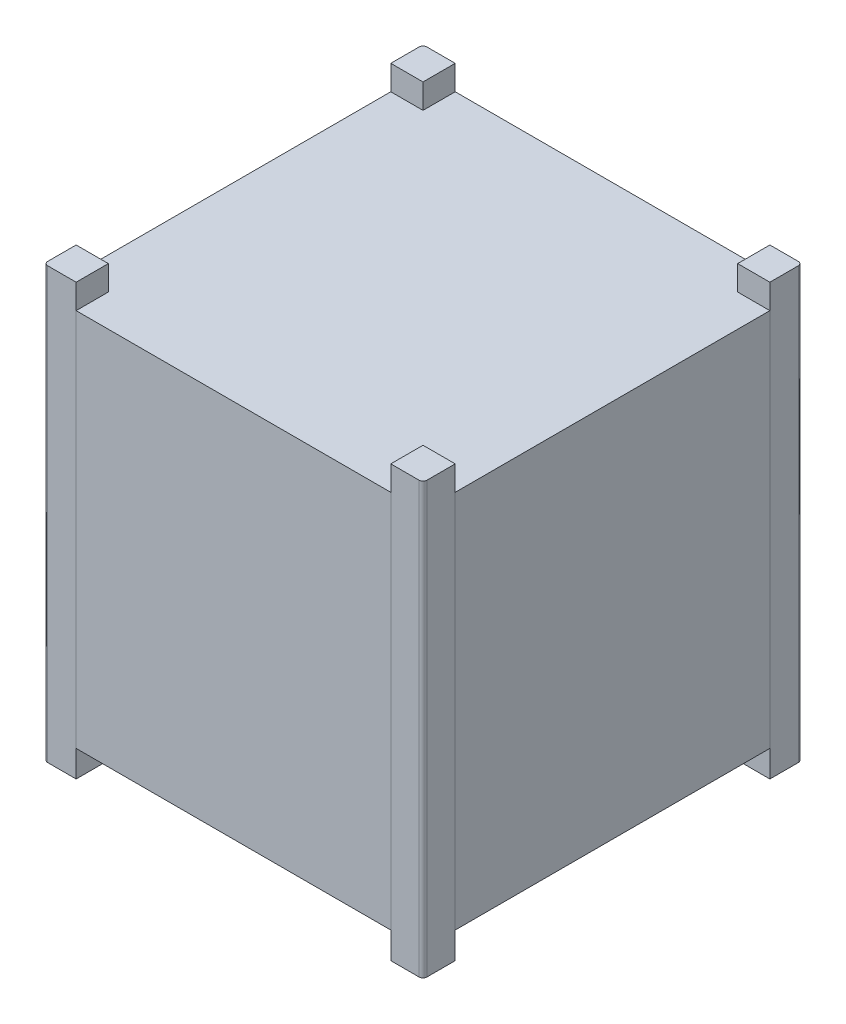
ISO-10303-21;
HEADER;
FILE_DESCRIPTION(('STEP AP214'),'2;1');
FILE_NAME('part.step','',(''),(''),'','','');
FILE_SCHEMA(('AUTOMOTIVE_DESIGN { 1 0 10303 214 1 1 1 1 }'));
ENDSEC;
DATA;
#1=APPLICATION_CONTEXT('core data for automotive mechanical design processes');
#2=APPLICATION_PROTOCOL_DEFINITION('international standard','automotive_design',2000,#1);
#3=PRODUCT_CONTEXT('',#1,'mechanical');
#4=PRODUCT('Part','Part','',(#3));
#5=PRODUCT_RELATED_PRODUCT_CATEGORY('part','',(#4));
#6=PRODUCT_DEFINITION_FORMATION('','',#4);
#7=PRODUCT_DEFINITION_CONTEXT('part definition',#1,'design');
#8=PRODUCT_DEFINITION('design','',#6,#7);
#9=PRODUCT_DEFINITION_SHAPE('','',#8);
#10=(LENGTH_UNIT() NAMED_UNIT(*) SI_UNIT(.MILLI.,.METRE.));
#11=(NAMED_UNIT(*) PLANE_ANGLE_UNIT() SI_UNIT($,.RADIAN.));
#12=(NAMED_UNIT(*) SI_UNIT($,.STERADIAN.) SOLID_ANGLE_UNIT());
#13=UNCERTAINTY_MEASURE_WITH_UNIT(LENGTH_MEASURE(1.E-05),#10,'distance_accuracy_value','');
#14=(GEOMETRIC_REPRESENTATION_CONTEXT(3) GLOBAL_UNCERTAINTY_ASSIGNED_CONTEXT((#13)) GLOBAL_UNIT_ASSIGNED_CONTEXT((#10,
#11,#12)) REPRESENTATION_CONTEXT('',''));
#15=CARTESIAN_POINT('',(0.,0.,0.));
#16=DIRECTION('',(0.,0.,1.));
#17=DIRECTION('',(1.,0.,0.));
#18=AXIS2_PLACEMENT_3D('',#15,#16,#17);
#19=CARTESIAN_POINT('',(50.,50.,50.));
#20=DIRECTION('',(-1.,0.,0.));
#21=DIRECTION('',(0.,0.,1.));
#22=AXIS2_PLACEMENT_3D('',#19,#20,#21);
#23=PLANE('',#22);
#24=DIRECTION('',(0.,1.,0.));
#25=VECTOR('',#24,1.);
#26=CARTESIAN_POINT('',(50.,50.,41.5));
#27=LINE('',#26,#25);
#28=CARTESIAN_POINT('',(50.,-50.,41.5));
#29=VERTEX_POINT('',#28);
#30=CARTESIAN_POINT('',(50.,50.,41.5));
#31=VERTEX_POINT('',#30);
#32=EDGE_CURVE('E582',#29,#31,#27,.T.);
#33=ORIENTED_EDGE('',*,*,#32,.F.);
#34=DIRECTION('',(0.,0.,-1.));
#35=VECTOR('',#34,1.);
#36=CARTESIAN_POINT('',(50.,-50.,50.));
#37=LINE('',#36,#35);
#38=CARTESIAN_POINT('',(50.,-50.,-41.5));
#39=VERTEX_POINT('',#38);
#40=EDGE_CURVE('E523',#29,#39,#37,.T.);
#41=ORIENTED_EDGE('',*,*,#40,.T.);
#42=DIRECTION('',(0.,-1.,0.));
#43=VECTOR('',#42,1.);
#44=CARTESIAN_POINT('',(50.,50.,-41.5));
#45=LINE('',#44,#43);
#46=CARTESIAN_POINT('',(50.,50.,-41.5));
#47=VERTEX_POINT('',#46);
#48=EDGE_CURVE('E576',#47,#39,#45,.T.);
#49=ORIENTED_EDGE('',*,*,#48,.F.);
#50=DIRECTION('',(0.,0.,-1.));
#51=VECTOR('',#50,1.);
#52=CARTESIAN_POINT('',(50.,50.,50.));
#53=LINE('',#52,#51);
#54=EDGE_CURVE('E524',#31,#47,#53,.T.);
#55=ORIENTED_EDGE('',*,*,#54,.F.);
#56=EDGE_LOOP('',(#33,#41,#49,#55));
#57=FACE_BOUND('',#56,.T.);
#58=ADVANCED_FACE('F45',(#57),#23,.F.);
#59=CARTESIAN_POINT('',(-50.,50.,50.));
#60=DIRECTION('',(1.,0.,0.));
#61=DIRECTION('',(0.,0.,-1.));
#62=AXIS2_PLACEMENT_3D('',#59,#60,#61);
#63=PLANE('',#62);
#64=DIRECTION('',(0.,-1.,0.));
#65=VECTOR('',#64,1.);
#66=CARTESIAN_POINT('',(-50.,50.,41.5));
#67=LINE('',#66,#65);
#68=CARTESIAN_POINT('',(-50.,50.,41.5));
#69=VERTEX_POINT('',#68);
#70=CARTESIAN_POINT('',(-50.,-50.,41.5));
#71=VERTEX_POINT('',#70);
#72=EDGE_CURVE('E579',#69,#71,#67,.T.);
#73=ORIENTED_EDGE('',*,*,#72,.F.);
#74=DIRECTION('',(0.,0.,1.));
#75=VECTOR('',#74,1.);
#76=CARTESIAN_POINT('',(-50.,50.,50.));
#77=LINE('',#76,#75);
#78=CARTESIAN_POINT('',(-50.,50.,-41.5));
#79=VERTEX_POINT('',#78);
#80=EDGE_CURVE('E533',#79,#69,#77,.T.);
#81=ORIENTED_EDGE('',*,*,#80,.F.);
#82=DIRECTION('',(0.,1.,0.));
#83=VECTOR('',#82,1.);
#84=CARTESIAN_POINT('',(-50.,50.,-41.5));
#85=LINE('',#84,#83);
#86=CARTESIAN_POINT('',(-50.,-50.,-41.5));
#87=VERTEX_POINT('',#86);
#88=EDGE_CURVE('E573',#87,#79,#85,.T.);
#89=ORIENTED_EDGE('',*,*,#88,.F.);
#90=DIRECTION('',(0.,0.,1.));
#91=VECTOR('',#90,1.);
#92=CARTESIAN_POINT('',(-50.,-50.,50.));
#93=LINE('',#92,#91);
#94=EDGE_CURVE('E548',#87,#71,#93,.T.);
#95=ORIENTED_EDGE('',*,*,#94,.T.);
#96=EDGE_LOOP('',(#73,#81,#89,#95));
#97=FACE_BOUND('',#96,.T.);
#98=ADVANCED_FACE('F693',(#97),#63,.F.);
#99=DIRECTION('',(0.,0.,1.));
#100=VECTOR('',#99,1.);
#101=CARTESIAN_POINT('',(50.,56.5,41.5));
#102=LINE('',#101,#100);
#103=CARTESIAN_POINT('',(50.,56.5,41.5));
#104=VERTEX_POINT('',#103);
#105=CARTESIAN_POINT('',(50.,56.5,49.));
#106=VERTEX_POINT('',#105);
#107=EDGE_CURVE('E451',#104,#106,#102,.T.);
#108=ORIENTED_EDGE('',*,*,#107,.T.);
#109=DIRECTION('',(0.,-1.,0.));
#110=VECTOR('',#109,1.);
#111=CARTESIAN_POINT('',(50.,50.,49.));
#112=LINE('',#111,#110);
#113=CARTESIAN_POINT('',(50.,-57.,49.));
#114=VERTEX_POINT('',#113);
#115=EDGE_CURVE('E621',#106,#114,#112,.T.);
#116=ORIENTED_EDGE('',*,*,#115,.T.);
#117=DIRECTION('',(0.,0.,1.));
#118=VECTOR('',#117,1.);
#119=CARTESIAN_POINT('',(50.,-57.,41.5));
#120=LINE('',#119,#118);
#121=CARTESIAN_POINT('',(50.,-57.,41.5));
#122=VERTEX_POINT('',#121);
#123=EDGE_CURVE('E448',#122,#114,#120,.T.);
#124=ORIENTED_EDGE('',*,*,#123,.F.);
#125=DIRECTION('',(0.,-1.,0.));
#126=VECTOR('',#125,1.);
#127=CARTESIAN_POINT('',(50.,56.5,41.5));
#128=LINE('',#127,#126);
#129=EDGE_CURVE('E426',#29,#122,#128,.T.);
#130=ORIENTED_EDGE('',*,*,#129,.F.);
#131=ORIENTED_EDGE('',*,*,#32,.T.);
#132=EDGE_CURVE('E427',#104,#31,#128,.T.);
#133=ORIENTED_EDGE('',*,*,#132,.F.);
#134=EDGE_LOOP('',(#108,#116,#124,#130,#131,#133));
#135=FACE_BOUND('',#134,.T.);
#136=ADVANCED_FACE('F755',(#135),#23,.F.);
#137=DIRECTION('',(0.,0.,1.));
#138=VECTOR('',#137,1.);
#139=CARTESIAN_POINT('',(-50.,-57.,41.5));
#140=LINE('',#139,#138);
#141=CARTESIAN_POINT('',(-50.,-57.,41.5));
#142=VERTEX_POINT('',#141);
#143=CARTESIAN_POINT('',(-50.,-57.,49.));
#144=VERTEX_POINT('',#143);
#145=EDGE_CURVE('E491',#142,#144,#140,.T.);
#146=ORIENTED_EDGE('',*,*,#145,.T.);
#147=DIRECTION('',(0.,-1.,0.));
#148=VECTOR('',#147,1.);
#149=CARTESIAN_POINT('',(-50.,50.,49.));
#150=LINE('',#149,#148);
#151=CARTESIAN_POINT('',(-50.,56.5,49.));
#152=VERTEX_POINT('',#151);
#153=EDGE_CURVE('E603',#144,#152,#150,.F.);
#154=ORIENTED_EDGE('',*,*,#153,.T.);
#155=DIRECTION('',(0.,0.,1.));
#156=VECTOR('',#155,1.);
#157=CARTESIAN_POINT('',(-50.,56.5,41.5));
#158=LINE('',#157,#156);
#159=CARTESIAN_POINT('',(-50.,56.5,41.5));
#160=VERTEX_POINT('',#159);
#161=EDGE_CURVE('E512',#160,#152,#158,.T.);
#162=ORIENTED_EDGE('',*,*,#161,.F.);
#163=DIRECTION('',(0.,1.,0.));
#164=VECTOR('',#163,1.);
#165=CARTESIAN_POINT('',(-50.,-57.,41.5));
#166=LINE('',#165,#164);
#167=EDGE_CURVE('E480',#69,#160,#166,.T.);
#168=ORIENTED_EDGE('',*,*,#167,.F.);
#169=ORIENTED_EDGE('',*,*,#72,.T.);
#170=EDGE_CURVE('E475',#142,#71,#166,.T.);
#171=ORIENTED_EDGE('',*,*,#170,.F.);
#172=EDGE_LOOP('',(#146,#154,#162,#168,#169,#171));
#173=FACE_BOUND('',#172,.T.);
#174=ADVANCED_FACE('F670',(#173),#63,.F.);
#175=CARTESIAN_POINT('',(-50.,50.,-50.));
#176=DIRECTION('',(0.,0.,1.));
#177=DIRECTION('',(1.,0.,0.));
#178=AXIS2_PLACEMENT_3D('',#175,#176,#177);
#179=PLANE('',#178);
#180=DIRECTION('',(0.,1.,0.));
#181=VECTOR('',#180,1.);
#182=CARTESIAN_POINT('',(41.5,50.,-50.));
#183=LINE('',#182,#181);
#184=CARTESIAN_POINT('',(41.5,-50.,-50.));
#185=VERTEX_POINT('',#184);
#186=CARTESIAN_POINT('',(41.5,50.,-50.));
#187=VERTEX_POINT('',#186);
#188=EDGE_CURVE('E570',#185,#187,#183,.T.);
#189=ORIENTED_EDGE('',*,*,#188,.F.);
#190=DIRECTION('',(-1.,0.,0.));
#191=VECTOR('',#190,1.);
#192=CARTESIAN_POINT('',(-50.,-50.,-50.));
#193=LINE('',#192,#191);
#194=CARTESIAN_POINT('',(-41.5,-50.,-50.));
#195=VERTEX_POINT('',#194);
#196=EDGE_CURVE('E545',#185,#195,#193,.T.);
#197=ORIENTED_EDGE('',*,*,#196,.T.);
#198=DIRECTION('',(0.,-1.,0.));
#199=VECTOR('',#198,1.);
#200=CARTESIAN_POINT('',(-41.5,50.,-50.));
#201=LINE('',#200,#199);
#202=CARTESIAN_POINT('',(-41.5,50.,-50.));
#203=VERTEX_POINT('',#202);
#204=EDGE_CURVE('E564',#203,#195,#201,.T.);
#205=ORIENTED_EDGE('',*,*,#204,.F.);
#206=DIRECTION('',(-1.,0.,0.));
#207=VECTOR('',#206,1.);
#208=CARTESIAN_POINT('',(-50.,50.,-50.));
#209=LINE('',#208,#207);
#210=EDGE_CURVE('E528',#187,#203,#209,.T.);
#211=ORIENTED_EDGE('',*,*,#210,.F.);
#212=EDGE_LOOP('',(#189,#197,#205,#211));
#213=FACE_BOUND('',#212,.T.);
#214=ADVANCED_FACE('F775',(#213),#179,.F.);
#215=CARTESIAN_POINT('',(-50.,50.,50.));
#216=DIRECTION('',(0.,0.,-1.));
#217=DIRECTION('',(-1.,0.,0.));
#218=AXIS2_PLACEMENT_3D('',#215,#216,#217);
#219=PLANE('',#218);
#220=DIRECTION('',(0.,-1.,0.));
#221=VECTOR('',#220,1.);
#222=CARTESIAN_POINT('',(41.5,50.,50.));
#223=LINE('',#222,#221);
#224=CARTESIAN_POINT('',(41.5,50.,50.));
#225=VERTEX_POINT('',#224);
#226=CARTESIAN_POINT('',(41.5,-50.,50.));
#227=VERTEX_POINT('',#226);
#228=EDGE_CURVE('E567',#225,#227,#223,.T.);
#229=ORIENTED_EDGE('',*,*,#228,.F.);
#230=DIRECTION('',(1.,0.,0.));
#231=VECTOR('',#230,1.);
#232=CARTESIAN_POINT('',(-50.,50.,50.));
#233=LINE('',#232,#231);
#234=CARTESIAN_POINT('',(-41.5,50.,50.));
#235=VERTEX_POINT('',#234);
#236=EDGE_CURVE('E537',#235,#225,#233,.T.);
#237=ORIENTED_EDGE('',*,*,#236,.F.);
#238=DIRECTION('',(0.,1.,0.));
#239=VECTOR('',#238,1.);
#240=CARTESIAN_POINT('',(-41.5,50.,50.));
#241=LINE('',#240,#239);
#242=CARTESIAN_POINT('',(-41.5,-50.,50.));
#243=VERTEX_POINT('',#242);
#244=EDGE_CURVE('E561',#243,#235,#241,.T.);
#245=ORIENTED_EDGE('',*,*,#244,.F.);
#246=DIRECTION('',(1.,0.,0.));
#247=VECTOR('',#246,1.);
#248=CARTESIAN_POINT('',(-50.,-50.,50.));
#249=LINE('',#248,#247);
#250=EDGE_CURVE('E529',#243,#227,#249,.T.);
#251=ORIENTED_EDGE('',*,*,#250,.T.);
#252=EDGE_LOOP('',(#229,#237,#245,#251));
#253=FACE_BOUND('',#252,.T.);
#254=ADVANCED_FACE('F736',(#253),#219,.F.);
#255=DIRECTION('',(1.,0.,0.));
#256=VECTOR('',#255,1.);
#257=CARTESIAN_POINT('',(41.5,56.5,-50.));
#258=LINE('',#257,#256);
#259=CARTESIAN_POINT('',(41.5,56.5,-50.));
#260=VERTEX_POINT('',#259);
#261=CARTESIAN_POINT('',(49.,56.5,-50.));
#262=VERTEX_POINT('',#261);
#263=EDGE_CURVE('E344',#260,#262,#258,.T.);
#264=ORIENTED_EDGE('',*,*,#263,.T.);
#265=DIRECTION('',(0.,-1.,0.));
#266=VECTOR('',#265,1.);
#267=CARTESIAN_POINT('',(49.,50.,-50.));
#268=LINE('',#267,#266);
#269=CARTESIAN_POINT('',(49.,-57.,-50.));
#270=VERTEX_POINT('',#269);
#271=EDGE_CURVE('E608',#262,#270,#268,.T.);
#272=ORIENTED_EDGE('',*,*,#271,.T.);
#273=DIRECTION('',(-1.,0.,0.));
#274=VECTOR('',#273,1.);
#275=CARTESIAN_POINT('',(41.5,-57.,-50.));
#276=LINE('',#275,#274);
#277=CARTESIAN_POINT('',(41.5,-57.,-50.));
#278=VERTEX_POINT('',#277);
#279=EDGE_CURVE('E340',#270,#278,#276,.T.);
#280=ORIENTED_EDGE('',*,*,#279,.T.);
#281=DIRECTION('',(0.,1.,0.));
#282=VECTOR('',#281,1.);
#283=CARTESIAN_POINT('',(41.5,56.5,-50.));
#284=LINE('',#283,#282);
#285=EDGE_CURVE('E302',#278,#185,#284,.T.);
#286=ORIENTED_EDGE('',*,*,#285,.T.);
#287=ORIENTED_EDGE('',*,*,#188,.T.);
#288=EDGE_CURVE('E341',#187,#260,#284,.T.);
#289=ORIENTED_EDGE('',*,*,#288,.T.);
#290=EDGE_LOOP('',(#264,#272,#280,#286,#287,#289));
#291=FACE_BOUND('',#290,.T.);
#292=ADVANCED_FACE('F821',(#291),#179,.F.);
#293=DIRECTION('',(-1.,0.,0.));
#294=VECTOR('',#293,1.);
#295=CARTESIAN_POINT('',(41.5,-57.,50.));
#296=LINE('',#295,#294);
#297=CARTESIAN_POINT('',(49.,-57.,50.));
#298=VERTEX_POINT('',#297);
#299=CARTESIAN_POINT('',(41.5,-57.,50.));
#300=VERTEX_POINT('',#299);
#301=EDGE_CURVE('E442',#298,#300,#296,.T.);
#302=ORIENTED_EDGE('',*,*,#301,.F.);
#303=DIRECTION('',(0.,-1.,0.));
#304=VECTOR('',#303,1.);
#305=CARTESIAN_POINT('',(49.,50.,50.));
#306=LINE('',#305,#304);
#307=CARTESIAN_POINT('',(49.,56.5,50.));
#308=VERTEX_POINT('',#307);
#309=EDGE_CURVE('E53',#298,#308,#306,.F.);
#310=ORIENTED_EDGE('',*,*,#309,.T.);
#311=DIRECTION('',(1.,0.,0.));
#312=VECTOR('',#311,1.);
#313=CARTESIAN_POINT('',(41.5,56.5,50.));
#314=LINE('',#313,#312);
#315=CARTESIAN_POINT('',(41.5,56.5,50.));
#316=VERTEX_POINT('',#315);
#317=EDGE_CURVE('E439',#316,#308,#314,.T.);
#318=ORIENTED_EDGE('',*,*,#317,.F.);
#319=DIRECTION('',(0.,1.,0.));
#320=VECTOR('',#319,1.);
#321=CARTESIAN_POINT('',(41.5,56.5,50.));
#322=LINE('',#321,#320);
#323=EDGE_CURVE('E417',#225,#316,#322,.T.);
#324=ORIENTED_EDGE('',*,*,#323,.F.);
#325=ORIENTED_EDGE('',*,*,#228,.T.);
#326=EDGE_CURVE('E435',#300,#227,#322,.T.);
#327=ORIENTED_EDGE('',*,*,#326,.F.);
#328=EDGE_LOOP('',(#302,#310,#318,#324,#325,#327));
#329=FACE_BOUND('',#328,.T.);
#330=ADVANCED_FACE('F739',(#329),#219,.F.);
#331=CARTESIAN_POINT('',(0.,50.,0.));
#332=DIRECTION('',(0.,-1.,0.));
#333=DIRECTION('',(0.,0.,-1.));
#334=AXIS2_PLACEMENT_3D('',#331,#332,#333);
#335=PLANE('',#334);
#336=DIRECTION('',(1.,0.,0.));
#337=VECTOR('',#336,1.);
#338=CARTESIAN_POINT('',(0.,50.,-41.5));
#339=LINE('',#338,#337);
#340=CARTESIAN_POINT('',(41.5,50.,-41.5));
#341=VERTEX_POINT('',#340);
#342=EDGE_CURVE('E365',#341,#47,#339,.T.);
#343=ORIENTED_EDGE('',*,*,#342,.F.);
#344=DIRECTION('',(0.,0.,-1.));
#345=VECTOR('',#344,1.);
#346=CARTESIAN_POINT('',(41.5,50.,0.));
#347=LINE('',#346,#345);
#348=EDGE_CURVE('E359',#341,#187,#347,.T.);
#349=ORIENTED_EDGE('',*,*,#348,.T.);
#350=ORIENTED_EDGE('',*,*,#210,.T.);
#351=DIRECTION('',(0.,0.,1.));
#352=VECTOR('',#351,1.);
#353=CARTESIAN_POINT('',(-41.5,50.,0.));
#354=LINE('',#353,#352);
#355=CARTESIAN_POINT('',(-41.5,50.,-41.5));
#356=VERTEX_POINT('',#355);
#357=EDGE_CURVE('E415',#203,#356,#354,.T.);
#358=ORIENTED_EDGE('',*,*,#357,.T.);
#359=DIRECTION('',(-1.,0.,0.));
#360=VECTOR('',#359,1.);
#361=CARTESIAN_POINT('',(0.,50.,-41.5));
#362=LINE('',#361,#360);
#363=EDGE_CURVE('E410',#356,#79,#362,.T.);
#364=ORIENTED_EDGE('',*,*,#363,.T.);
#365=ORIENTED_EDGE('',*,*,#80,.T.);
#366=DIRECTION('',(1.,0.,0.));
#367=VECTOR('',#366,1.);
#368=CARTESIAN_POINT('',(0.,50.,41.5));
#369=LINE('',#368,#367);
#370=CARTESIAN_POINT('',(-41.5,50.,41.5));
#371=VERTEX_POINT('',#370);
#372=EDGE_CURVE('E516',#69,#371,#369,.T.);
#373=ORIENTED_EDGE('',*,*,#372,.T.);
#374=DIRECTION('',(0.,0.,-1.));
#375=VECTOR('',#374,1.);
#376=CARTESIAN_POINT('',(-41.5,50.,0.));
#377=LINE('',#376,#375);
#378=EDGE_CURVE('E519',#235,#371,#377,.T.);
#379=ORIENTED_EDGE('',*,*,#378,.F.);
#380=ORIENTED_EDGE('',*,*,#236,.T.);
#381=DIRECTION('',(0.,0.,1.));
#382=VECTOR('',#381,1.);
#383=CARTESIAN_POINT('',(41.5,50.,0.));
#384=LINE('',#383,#382);
#385=CARTESIAN_POINT('',(41.5,50.,41.5));
#386=VERTEX_POINT('',#385);
#387=EDGE_CURVE('E463',#386,#225,#384,.T.);
#388=ORIENTED_EDGE('',*,*,#387,.F.);
#389=DIRECTION('',(-1.,0.,0.));
#390=VECTOR('',#389,1.);
#391=CARTESIAN_POINT('',(0.,50.,41.5));
#392=LINE('',#391,#390);
#393=EDGE_CURVE('E470',#31,#386,#392,.T.);
#394=ORIENTED_EDGE('',*,*,#393,.F.);
#395=ORIENTED_EDGE('',*,*,#54,.T.);
#396=EDGE_LOOP('',(#343,#349,#350,#358,#364,#365,#373,#379,#380,#388,#394,#395));
#397=FACE_BOUND('',#396,.T.);
#398=ADVANCED_FACE('F688',(#397),#335,.F.);
#399=CARTESIAN_POINT('',(0.,-50.,0.));
#400=DIRECTION('',(0.,-1.,0.));
#401=DIRECTION('',(0.,0.,-1.));
#402=AXIS2_PLACEMENT_3D('',#399,#400,#401);
#403=PLANE('',#402);
#404=DIRECTION('',(0.,0.,-1.));
#405=VECTOR('',#404,1.);
#406=CARTESIAN_POINT('',(41.5,-50.,0.));
#407=LINE('',#406,#405);
#408=CARTESIAN_POINT('',(41.5,-50.,-41.5));
#409=VERTEX_POINT('',#408);
#410=EDGE_CURVE('E307',#409,#185,#407,.T.);
#411=ORIENTED_EDGE('',*,*,#410,.F.);
#412=DIRECTION('',(1.,0.,0.));
#413=VECTOR('',#412,1.);
#414=CARTESIAN_POINT('',(0.,-50.,-41.5));
#415=LINE('',#414,#413);
#416=EDGE_CURVE('E316',#409,#39,#415,.T.);
#417=ORIENTED_EDGE('',*,*,#416,.T.);
#418=ORIENTED_EDGE('',*,*,#40,.F.);
#419=DIRECTION('',(-1.,0.,0.));
#420=VECTOR('',#419,1.);
#421=CARTESIAN_POINT('',(0.,-50.,41.5));
#422=LINE('',#421,#420);
#423=CARTESIAN_POINT('',(41.5,-50.,41.5));
#424=VERTEX_POINT('',#423);
#425=EDGE_CURVE('E466',#29,#424,#422,.T.);
#426=ORIENTED_EDGE('',*,*,#425,.T.);
#427=DIRECTION('',(0.,0.,1.));
#428=VECTOR('',#427,1.);
#429=CARTESIAN_POINT('',(41.5,-50.,0.));
#430=LINE('',#429,#428);
#431=EDGE_CURVE('E459',#424,#227,#430,.T.);
#432=ORIENTED_EDGE('',*,*,#431,.T.);
#433=ORIENTED_EDGE('',*,*,#250,.F.);
#434=DIRECTION('',(0.,0.,-1.));
#435=VECTOR('',#434,1.);
#436=CARTESIAN_POINT('',(-41.5,-50.,0.));
#437=LINE('',#436,#435);
#438=CARTESIAN_POINT('',(-41.5,-50.,41.5));
#439=VERTEX_POINT('',#438);
#440=EDGE_CURVE('E557',#243,#439,#437,.T.);
#441=ORIENTED_EDGE('',*,*,#440,.T.);
#442=DIRECTION('',(1.,0.,0.));
#443=VECTOR('',#442,1.);
#444=CARTESIAN_POINT('',(0.,-50.,41.5));
#445=LINE('',#444,#443);
#446=EDGE_CURVE('E541',#71,#439,#445,.T.);
#447=ORIENTED_EDGE('',*,*,#446,.F.);
#448=ORIENTED_EDGE('',*,*,#94,.F.);
#449=DIRECTION('',(-1.,0.,0.));
#450=VECTOR('',#449,1.);
#451=CARTESIAN_POINT('',(0.,-50.,-41.5));
#452=LINE('',#451,#450);
#453=CARTESIAN_POINT('',(-41.5,-50.,-41.5));
#454=VERTEX_POINT('',#453);
#455=EDGE_CURVE('E407',#454,#87,#452,.T.);
#456=ORIENTED_EDGE('',*,*,#455,.F.);
#457=DIRECTION('',(0.,0.,1.));
#458=VECTOR('',#457,1.);
#459=CARTESIAN_POINT('',(-41.5,-50.,0.));
#460=LINE('',#459,#458);
#461=EDGE_CURVE('E413',#195,#454,#460,.T.);
#462=ORIENTED_EDGE('',*,*,#461,.F.);
#463=ORIENTED_EDGE('',*,*,#196,.F.);
#464=EDGE_LOOP('',(#411,#417,#418,#426,#432,#433,#441,#447,#448,#456,#462,#463));
#465=FACE_BOUND('',#464,.T.);
#466=ADVANCED_FACE('F722',(#465),#403,.T.);
#467=DIRECTION('',(0.,0.,-1.));
#468=VECTOR('',#467,1.);
#469=CARTESIAN_POINT('',(50.,-57.,-41.5));
#470=LINE('',#469,#468);
#471=CARTESIAN_POINT('',(50.,-57.,-41.5));
#472=VERTEX_POINT('',#471);
#473=CARTESIAN_POINT('',(50.,-57.,-49.));
#474=VERTEX_POINT('',#473);
#475=EDGE_CURVE('E308',#472,#474,#470,.T.);
#476=ORIENTED_EDGE('',*,*,#475,.T.);
#477=DIRECTION('',(0.,-1.,0.));
#478=VECTOR('',#477,1.);
#479=CARTESIAN_POINT('',(50.,50.,-49.));
#480=LINE('',#479,#478);
#481=CARTESIAN_POINT('',(50.,56.5,-49.));
#482=VERTEX_POINT('',#481);
#483=EDGE_CURVE('E615',#474,#482,#480,.F.);
#484=ORIENTED_EDGE('',*,*,#483,.T.);
#485=DIRECTION('',(0.,0.,-1.));
#486=VECTOR('',#485,1.);
#487=CARTESIAN_POINT('',(50.,56.5,-41.5));
#488=LINE('',#487,#486);
#489=CARTESIAN_POINT('',(50.,56.5,-41.5));
#490=VERTEX_POINT('',#489);
#491=EDGE_CURVE('E351',#490,#482,#488,.T.);
#492=ORIENTED_EDGE('',*,*,#491,.F.);
#493=DIRECTION('',(0.,-1.,0.));
#494=VECTOR('',#493,1.);
#495=CARTESIAN_POINT('',(50.,56.5,-41.5));
#496=LINE('',#495,#494);
#497=EDGE_CURVE('E328',#490,#47,#496,.T.);
#498=ORIENTED_EDGE('',*,*,#497,.T.);
#499=ORIENTED_EDGE('',*,*,#48,.T.);
#500=EDGE_CURVE('E324',#39,#472,#496,.T.);
#501=ORIENTED_EDGE('',*,*,#500,.T.);
#502=EDGE_LOOP('',(#476,#484,#492,#498,#499,#501));
#503=FACE_BOUND('',#502,.T.);
#504=ADVANCED_FACE('F770',(#503),#23,.F.);
#505=DIRECTION('',(-1.,0.,0.));
#506=VECTOR('',#505,1.);
#507=CARTESIAN_POINT('',(-50.,-57.,-50.));
#508=LINE('',#507,#506);
#509=CARTESIAN_POINT('',(-41.5,-57.,-50.));
#510=VERTEX_POINT('',#509);
#511=CARTESIAN_POINT('',(-49.,-57.,-50.));
#512=VERTEX_POINT('',#511);
#513=EDGE_CURVE('E369',#510,#512,#508,.T.);
#514=ORIENTED_EDGE('',*,*,#513,.T.);
#515=DIRECTION('',(0.,-1.,0.));
#516=VECTOR('',#515,1.);
#517=CARTESIAN_POINT('',(-49.,50.,-50.));
#518=LINE('',#517,#516);
#519=CARTESIAN_POINT('',(-49.,56.5,-50.));
#520=VERTEX_POINT('',#519);
#521=EDGE_CURVE('E591',#512,#520,#518,.F.);
#522=ORIENTED_EDGE('',*,*,#521,.T.);
#523=DIRECTION('',(1.,0.,0.));
#524=VECTOR('',#523,1.);
#525=CARTESIAN_POINT('',(-50.,56.5,-50.));
#526=LINE('',#525,#524);
#527=CARTESIAN_POINT('',(-41.5,56.5,-50.));
#528=VERTEX_POINT('',#527);
#529=EDGE_CURVE('E393',#520,#528,#526,.T.);
#530=ORIENTED_EDGE('',*,*,#529,.T.);
#531=DIRECTION('',(0.,-1.,0.));
#532=VECTOR('',#531,1.);
#533=CARTESIAN_POINT('',(-41.5,-57.,-50.));
#534=LINE('',#533,#532);
#535=EDGE_CURVE('E390',#528,#203,#534,.T.);
#536=ORIENTED_EDGE('',*,*,#535,.T.);
#537=ORIENTED_EDGE('',*,*,#204,.T.);
#538=EDGE_CURVE('E389',#195,#510,#534,.T.);
#539=ORIENTED_EDGE('',*,*,#538,.T.);
#540=EDGE_LOOP('',(#514,#522,#530,#536,#537,#539));
#541=FACE_BOUND('',#540,.T.);
#542=ADVANCED_FACE('F780',(#541),#179,.F.);
#543=DIRECTION('',(0.,0.,-1.));
#544=VECTOR('',#543,1.);
#545=CARTESIAN_POINT('',(-50.,56.5,-41.5));
#546=LINE('',#545,#544);
#547=CARTESIAN_POINT('',(-50.,56.5,-41.5));
#548=VERTEX_POINT('',#547);
#549=CARTESIAN_POINT('',(-50.,56.5,-49.));
#550=VERTEX_POINT('',#549);
#551=EDGE_CURVE('E386',#548,#550,#546,.T.);
#552=ORIENTED_EDGE('',*,*,#551,.T.);
#553=DIRECTION('',(0.,-1.,0.));
#554=VECTOR('',#553,1.);
#555=CARTESIAN_POINT('',(-50.,50.,-49.));
#556=LINE('',#555,#554);
#557=CARTESIAN_POINT('',(-50.,-57.,-49.));
#558=VERTEX_POINT('',#557);
#559=EDGE_CURVE('E585',#550,#558,#556,.T.);
#560=ORIENTED_EDGE('',*,*,#559,.T.);
#561=DIRECTION('',(0.,0.,-1.));
#562=VECTOR('',#561,1.);
#563=CARTESIAN_POINT('',(-50.,-57.,-41.5));
#564=LINE('',#563,#562);
#565=CARTESIAN_POINT('',(-50.,-57.,-41.5));
#566=VERTEX_POINT('',#565);
#567=EDGE_CURVE('E403',#566,#558,#564,.T.);
#568=ORIENTED_EDGE('',*,*,#567,.F.);
#569=DIRECTION('',(0.,1.,0.));
#570=VECTOR('',#569,1.);
#571=CARTESIAN_POINT('',(-50.,-57.,-41.5));
#572=LINE('',#571,#570);
#573=EDGE_CURVE('E370',#566,#87,#572,.T.);
#574=ORIENTED_EDGE('',*,*,#573,.T.);
#575=ORIENTED_EDGE('',*,*,#88,.T.);
#576=EDGE_CURVE('E375',#79,#548,#572,.T.);
#577=ORIENTED_EDGE('',*,*,#576,.T.);
#578=EDGE_LOOP('',(#552,#560,#568,#574,#575,#577));
#579=FACE_BOUND('',#578,.T.);
#580=ADVANCED_FACE('F700',(#579),#63,.F.);
#581=DIRECTION('',(1.,0.,0.));
#582=VECTOR('',#581,1.);
#583=CARTESIAN_POINT('',(-50.,56.5,50.));
#584=LINE('',#583,#582);
#585=CARTESIAN_POINT('',(-49.,56.5,50.));
#586=VERTEX_POINT('',#585);
#587=CARTESIAN_POINT('',(-41.5,56.5,50.));
#588=VERTEX_POINT('',#587);
#589=EDGE_CURVE('E474',#586,#588,#584,.T.);
#590=ORIENTED_EDGE('',*,*,#589,.F.);
#591=DIRECTION('',(0.,-1.,0.));
#592=VECTOR('',#591,1.);
#593=CARTESIAN_POINT('',(-49.,50.,50.));
#594=LINE('',#593,#592);
#595=CARTESIAN_POINT('',(-49.,-57.,50.));
#596=VERTEX_POINT('',#595);
#597=EDGE_CURVE('E596',#586,#596,#594,.T.);
#598=ORIENTED_EDGE('',*,*,#597,.T.);
#599=DIRECTION('',(-1.,0.,0.));
#600=VECTOR('',#599,1.);
#601=CARTESIAN_POINT('',(-50.,-57.,50.));
#602=LINE('',#601,#600);
#603=CARTESIAN_POINT('',(-41.5,-57.,50.));
#604=VERTEX_POINT('',#603);
#605=EDGE_CURVE('E498',#604,#596,#602,.T.);
#606=ORIENTED_EDGE('',*,*,#605,.F.);
#607=DIRECTION('',(0.,-1.,0.));
#608=VECTOR('',#607,1.);
#609=CARTESIAN_POINT('',(-41.5,-57.,50.));
#610=LINE('',#609,#608);
#611=EDGE_CURVE('E493',#243,#604,#610,.T.);
#612=ORIENTED_EDGE('',*,*,#611,.F.);
#613=ORIENTED_EDGE('',*,*,#244,.T.);
#614=EDGE_CURVE('E494',#588,#235,#610,.T.);
#615=ORIENTED_EDGE('',*,*,#614,.F.);
#616=EDGE_LOOP('',(#590,#598,#606,#612,#613,#615));
#617=FACE_BOUND('',#616,.T.);
#618=ADVANCED_FACE('F680',(#617),#219,.F.);
#619=CARTESIAN_POINT('',(-50.,-57.,41.5));
#620=DIRECTION('',(0.,1.,0.));
#621=DIRECTION('',(0.,0.,1.));
#622=AXIS2_PLACEMENT_3D('',#619,#620,#621);
#623=PLANE('',#622);
#624=ORIENTED_EDGE('',*,*,#605,.T.);
#625=CARTESIAN_POINT('',(-49.,-57.,49.));
#626=DIRECTION('',(0.,1.,0.));
#627=DIRECTION('',(0.,0.,1.));
#628=AXIS2_PLACEMENT_3D('',#625,#626,#627);
#629=CIRCLE('',#628,1.);
#630=EDGE_CURVE('E600',#596,#144,#629,.F.);
#631=ORIENTED_EDGE('',*,*,#630,.T.);
#632=ORIENTED_EDGE('',*,*,#145,.F.);
#633=DIRECTION('',(-1.,0.,0.));
#634=VECTOR('',#633,1.);
#635=CARTESIAN_POINT('',(-50.,-57.,41.5));
#636=LINE('',#635,#634);
#637=CARTESIAN_POINT('',(-41.5,-57.,41.5));
#638=VERTEX_POINT('',#637);
#639=EDGE_CURVE('E488',#638,#142,#636,.T.);
#640=ORIENTED_EDGE('',*,*,#639,.F.);
#641=DIRECTION('',(0.,0.,1.));
#642=VECTOR('',#641,1.);
#643=CARTESIAN_POINT('',(-41.5,-57.,41.5));
#644=LINE('',#643,#642);
#645=EDGE_CURVE('E505',#638,#604,#644,.T.);
#646=ORIENTED_EDGE('',*,*,#645,.T.);
#647=EDGE_LOOP('',(#624,#631,#632,#640,#646));
#648=FACE_BOUND('',#647,.T.);
#649=ADVANCED_FACE('F730',(#648),#623,.F.);
#650=CARTESIAN_POINT('',(0.,0.,41.5));
#651=DIRECTION('',(0.,0.,-1.));
#652=DIRECTION('',(-1.,0.,0.));
#653=AXIS2_PLACEMENT_3D('',#650,#651,#652);
#654=PLANE('',#653);
#655=ORIENTED_EDGE('',*,*,#170,.T.);
#656=ORIENTED_EDGE('',*,*,#446,.T.);
#657=DIRECTION('',(0.,-1.,0.));
#658=VECTOR('',#657,1.);
#659=CARTESIAN_POINT('',(-41.5,-57.,41.5));
#660=LINE('',#659,#658);
#661=EDGE_CURVE('E483',#439,#638,#660,.T.);
#662=ORIENTED_EDGE('',*,*,#661,.T.);
#663=ORIENTED_EDGE('',*,*,#639,.T.);
#664=EDGE_LOOP('',(#655,#656,#662,#663));
#665=FACE_BOUND('',#664,.T.);
#666=ADVANCED_FACE('F725',(#665),#654,.T.);
#667=CARTESIAN_POINT('',(-41.5,-57.,41.5));
#668=DIRECTION('',(-1.,0.,0.));
#669=DIRECTION('',(0.,-1.,0.));
#670=AXIS2_PLACEMENT_3D('',#667,#668,#669);
#671=PLANE('',#670);
#672=ORIENTED_EDGE('',*,*,#440,.F.);
#673=ORIENTED_EDGE('',*,*,#611,.T.);
#674=ORIENTED_EDGE('',*,*,#645,.F.);
#675=ORIENTED_EDGE('',*,*,#661,.F.);
#676=EDGE_LOOP('',(#672,#673,#674,#675));
#677=FACE_BOUND('',#676,.T.);
#678=ADVANCED_FACE('F734',(#677),#671,.F.);
#679=ORIENTED_EDGE('',*,*,#614,.T.);
#680=ORIENTED_EDGE('',*,*,#378,.T.);
#681=CARTESIAN_POINT('',(-41.5,56.5,41.5));
#682=VERTEX_POINT('',#681);
#683=EDGE_CURVE('E484',#682,#371,#660,.T.);
#684=ORIENTED_EDGE('',*,*,#683,.F.);
#685=DIRECTION('',(0.,0.,1.));
#686=VECTOR('',#685,1.);
#687=CARTESIAN_POINT('',(-41.5,56.5,41.5));
#688=LINE('',#687,#686);
#689=EDGE_CURVE('E509',#682,#588,#688,.T.);
#690=ORIENTED_EDGE('',*,*,#689,.T.);
#691=EDGE_LOOP('',(#679,#680,#684,#690));
#692=FACE_BOUND('',#691,.T.);
#693=ADVANCED_FACE('F685',(#692),#671,.F.);
#694=ORIENTED_EDGE('',*,*,#372,.F.);
#695=ORIENTED_EDGE('',*,*,#167,.T.);
#696=DIRECTION('',(1.,0.,0.));
#697=VECTOR('',#696,1.);
#698=CARTESIAN_POINT('',(-50.,56.5,41.5));
#699=LINE('',#698,#697);
#700=EDGE_CURVE('E479',#160,#682,#699,.T.);
#701=ORIENTED_EDGE('',*,*,#700,.T.);
#702=ORIENTED_EDGE('',*,*,#683,.T.);
#703=EDGE_LOOP('',(#694,#695,#701,#702));
#704=FACE_BOUND('',#703,.T.);
#705=ADVANCED_FACE('F662',(#704),#654,.T.);
#706=CARTESIAN_POINT('',(-50.,56.5,41.5));
#707=DIRECTION('',(0.,-1.,0.));
#708=DIRECTION('',(0.,0.,-1.));
#709=AXIS2_PLACEMENT_3D('',#706,#707,#708);
#710=PLANE('',#709);
#711=ORIENTED_EDGE('',*,*,#161,.T.);
#712=CARTESIAN_POINT('',(-49.,56.5,49.));
#713=DIRECTION('',(0.,-1.,0.));
#714=DIRECTION('',(0.,0.,-1.));
#715=AXIS2_PLACEMENT_3D('',#712,#713,#714);
#716=CIRCLE('',#715,1.);
#717=EDGE_CURVE('E606',#152,#586,#716,.F.);
#718=ORIENTED_EDGE('',*,*,#717,.T.);
#719=ORIENTED_EDGE('',*,*,#589,.T.);
#720=ORIENTED_EDGE('',*,*,#689,.F.);
#721=ORIENTED_EDGE('',*,*,#700,.F.);
#722=EDGE_LOOP('',(#711,#718,#719,#720,#721));
#723=FACE_BOUND('',#722,.T.);
#724=ADVANCED_FACE('F667',(#723),#710,.F.);
#725=CARTESIAN_POINT('',(41.5,-57.,41.5));
#726=DIRECTION('',(0.,1.,0.));
#727=DIRECTION('',(0.,0.,1.));
#728=AXIS2_PLACEMENT_3D('',#725,#726,#727);
#729=PLANE('',#728);
#730=ORIENTED_EDGE('',*,*,#123,.T.);
#731=CARTESIAN_POINT('',(49.,-57.,49.));
#732=DIRECTION('',(0.,1.,0.));
#733=DIRECTION('',(0.,0.,1.));
#734=AXIS2_PLACEMENT_3D('',#731,#732,#733);
#735=CIRCLE('',#734,1.);
#736=EDGE_CURVE('E70',#114,#298,#735,.F.);
#737=ORIENTED_EDGE('',*,*,#736,.T.);
#738=ORIENTED_EDGE('',*,*,#301,.T.);
#739=DIRECTION('',(0.,0.,1.));
#740=VECTOR('',#739,1.);
#741=CARTESIAN_POINT('',(41.5,-57.,41.5));
#742=LINE('',#741,#740);
#743=CARTESIAN_POINT('',(41.5,-57.,41.5));
#744=VERTEX_POINT('',#743);
#745=EDGE_CURVE('E434',#744,#300,#742,.T.);
#746=ORIENTED_EDGE('',*,*,#745,.F.);
#747=DIRECTION('',(-1.,0.,0.));
#748=VECTOR('',#747,1.);
#749=CARTESIAN_POINT('',(41.5,-57.,41.5));
#750=LINE('',#749,#748);
#751=EDGE_CURVE('E431',#122,#744,#750,.T.);
#752=ORIENTED_EDGE('',*,*,#751,.F.);
#753=EDGE_LOOP('',(#730,#737,#738,#746,#752));
#754=FACE_BOUND('',#753,.T.);
#755=ADVANCED_FACE('F745',(#754),#729,.F.);
#756=CARTESIAN_POINT('',(0.,0.,41.5));
#757=DIRECTION('',(0.,0.,1.));
#758=DIRECTION('',(1.,0.,0.));
#759=AXIS2_PLACEMENT_3D('',#756,#757,#758);
#760=PLANE('',#759);
#761=ORIENTED_EDGE('',*,*,#425,.F.);
#762=ORIENTED_EDGE('',*,*,#129,.T.);
#763=ORIENTED_EDGE('',*,*,#751,.T.);
#764=DIRECTION('',(0.,1.,0.));
#765=VECTOR('',#764,1.);
#766=CARTESIAN_POINT('',(41.5,56.5,41.5));
#767=LINE('',#766,#765);
#768=EDGE_CURVE('E418',#744,#424,#767,.T.);
#769=ORIENTED_EDGE('',*,*,#768,.T.);
#770=EDGE_LOOP('',(#761,#762,#763,#769));
#771=FACE_BOUND('',#770,.T.);
#772=ADVANCED_FACE('F796',(#771),#760,.F.);
#773=CARTESIAN_POINT('',(41.5,56.5,41.5));
#774=DIRECTION('',(1.,0.,0.));
#775=DIRECTION('',(0.,0.,-1.));
#776=AXIS2_PLACEMENT_3D('',#773,#774,#775);
#777=PLANE('',#776);
#778=ORIENTED_EDGE('',*,*,#431,.F.);
#779=ORIENTED_EDGE('',*,*,#768,.F.);
#780=ORIENTED_EDGE('',*,*,#745,.T.);
#781=ORIENTED_EDGE('',*,*,#326,.T.);
#782=EDGE_LOOP('',(#778,#779,#780,#781));
#783=FACE_BOUND('',#782,.T.);
#784=ADVANCED_FACE('F741',(#783),#777,.F.);
#785=ORIENTED_EDGE('',*,*,#132,.T.);
#786=ORIENTED_EDGE('',*,*,#393,.T.);
#787=CARTESIAN_POINT('',(41.5,56.5,41.5));
#788=VERTEX_POINT('',#787);
#789=EDGE_CURVE('E423',#386,#788,#767,.T.);
#790=ORIENTED_EDGE('',*,*,#789,.T.);
#791=DIRECTION('',(1.,0.,0.));
#792=VECTOR('',#791,1.);
#793=CARTESIAN_POINT('',(41.5,56.5,41.5));
#794=LINE('',#793,#792);
#795=EDGE_CURVE('E422',#788,#104,#794,.T.);
#796=ORIENTED_EDGE('',*,*,#795,.T.);
#797=EDGE_LOOP('',(#785,#786,#790,#796));
#798=FACE_BOUND('',#797,.T.);
#799=ADVANCED_FACE('F760',(#798),#760,.F.);
#800=ORIENTED_EDGE('',*,*,#789,.F.);
#801=ORIENTED_EDGE('',*,*,#387,.T.);
#802=ORIENTED_EDGE('',*,*,#323,.T.);
#803=DIRECTION('',(0.,0.,1.));
#804=VECTOR('',#803,1.);
#805=CARTESIAN_POINT('',(41.5,56.5,41.5));
#806=LINE('',#805,#804);
#807=EDGE_CURVE('E455',#788,#316,#806,.T.);
#808=ORIENTED_EDGE('',*,*,#807,.F.);
#809=EDGE_LOOP('',(#800,#801,#802,#808));
#810=FACE_BOUND('',#809,.T.);
#811=ADVANCED_FACE('F764',(#810),#777,.F.);
#812=CARTESIAN_POINT('',(41.5,56.5,41.5));
#813=DIRECTION('',(0.,-1.,0.));
#814=DIRECTION('',(0.,0.,-1.));
#815=AXIS2_PLACEMENT_3D('',#812,#813,#814);
#816=PLANE('',#815);
#817=ORIENTED_EDGE('',*,*,#317,.T.);
#818=CARTESIAN_POINT('',(49.,56.5,49.));
#819=DIRECTION('',(0.,-1.,0.));
#820=DIRECTION('',(0.,0.,-1.));
#821=AXIS2_PLACEMENT_3D('',#818,#819,#820);
#822=CIRCLE('',#821,1.);
#823=EDGE_CURVE('E11',#308,#106,#822,.F.);
#824=ORIENTED_EDGE('',*,*,#823,.T.);
#825=ORIENTED_EDGE('',*,*,#107,.F.);
#826=ORIENTED_EDGE('',*,*,#795,.F.);
#827=ORIENTED_EDGE('',*,*,#807,.T.);
#828=EDGE_LOOP('',(#817,#824,#825,#826,#827));
#829=FACE_BOUND('',#828,.T.);
#830=ADVANCED_FACE('F751',(#829),#816,.F.);
#831=CARTESIAN_POINT('',(-50.,-57.,-41.5));
#832=DIRECTION('',(0.,-1.,0.));
#833=DIRECTION('',(0.,0.,-1.));
#834=AXIS2_PLACEMENT_3D('',#831,#832,#833);
#835=PLANE('',#834);
#836=ORIENTED_EDGE('',*,*,#567,.T.);
#837=CARTESIAN_POINT('',(-49.,-57.,-49.));
#838=DIRECTION('',(0.,-1.,0.));
#839=DIRECTION('',(0.,0.,-1.));
#840=AXIS2_PLACEMENT_3D('',#837,#838,#839);
#841=CIRCLE('',#840,1.);
#842=EDGE_CURVE('E589',#558,#512,#841,.T.);
#843=ORIENTED_EDGE('',*,*,#842,.T.);
#844=ORIENTED_EDGE('',*,*,#513,.F.);
#845=DIRECTION('',(0.,0.,-1.));
#846=VECTOR('',#845,1.);
#847=CARTESIAN_POINT('',(-41.5,-57.,-41.5));
#848=LINE('',#847,#846);
#849=CARTESIAN_POINT('',(-41.5,-57.,-41.5));
#850=VERTEX_POINT('',#849);
#851=EDGE_CURVE('E400',#850,#510,#848,.T.);
#852=ORIENTED_EDGE('',*,*,#851,.F.);
#853=DIRECTION('',(-1.,0.,0.));
#854=VECTOR('',#853,1.);
#855=CARTESIAN_POINT('',(-50.,-57.,-41.5));
#856=LINE('',#855,#854);
#857=EDGE_CURVE('E374',#850,#566,#856,.T.);
#858=ORIENTED_EDGE('',*,*,#857,.T.);
#859=EDGE_LOOP('',(#836,#843,#844,#852,#858));
#860=FACE_BOUND('',#859,.T.);
#861=ADVANCED_FACE('F711',(#860),#835,.T.);
#862=CARTESIAN_POINT('',(0.,0.,-41.5));
#863=DIRECTION('',(0.,0.,1.));
#864=DIRECTION('',(-1.,0.,0.));
#865=AXIS2_PLACEMENT_3D('',#862,#863,#864);
#866=PLANE('',#865);
#867=DIRECTION('',(0.,-1.,0.));
#868=VECTOR('',#867,1.);
#869=CARTESIAN_POINT('',(-41.5,-57.,-41.5));
#870=LINE('',#869,#868);
#871=EDGE_CURVE('E379',#454,#850,#870,.T.);
#872=ORIENTED_EDGE('',*,*,#871,.F.);
#873=ORIENTED_EDGE('',*,*,#455,.T.);
#874=ORIENTED_EDGE('',*,*,#573,.F.);
#875=ORIENTED_EDGE('',*,*,#857,.F.);
#876=EDGE_LOOP('',(#872,#873,#874,#875));
#877=FACE_BOUND('',#876,.T.);
#878=ADVANCED_FACE('F717',(#877),#866,.T.);
#879=CARTESIAN_POINT('',(-41.5,-57.,-41.5));
#880=DIRECTION('',(1.,0.,0.));
#881=DIRECTION('',(0.,1.,0.));
#882=AXIS2_PLACEMENT_3D('',#879,#880,#881);
#883=PLANE('',#882);
#884=ORIENTED_EDGE('',*,*,#538,.F.);
#885=ORIENTED_EDGE('',*,*,#461,.T.);
#886=ORIENTED_EDGE('',*,*,#871,.T.);
#887=ORIENTED_EDGE('',*,*,#851,.T.);
#888=EDGE_LOOP('',(#884,#885,#886,#887));
#889=FACE_BOUND('',#888,.T.);
#890=ADVANCED_FACE('F778',(#889),#883,.T.);
#891=ORIENTED_EDGE('',*,*,#357,.F.);
#892=ORIENTED_EDGE('',*,*,#535,.F.);
#893=DIRECTION('',(0.,0.,-1.));
#894=VECTOR('',#893,1.);
#895=CARTESIAN_POINT('',(-41.5,56.5,-41.5));
#896=LINE('',#895,#894);
#897=CARTESIAN_POINT('',(-41.5,56.5,-41.5));
#898=VERTEX_POINT('',#897);
#899=EDGE_CURVE('E397',#898,#528,#896,.T.);
#900=ORIENTED_EDGE('',*,*,#899,.F.);
#901=EDGE_CURVE('E380',#898,#356,#870,.T.);
#902=ORIENTED_EDGE('',*,*,#901,.T.);
#903=EDGE_LOOP('',(#891,#892,#900,#902));
#904=FACE_BOUND('',#903,.T.);
#905=ADVANCED_FACE('F784',(#904),#883,.T.);
#906=ORIENTED_EDGE('',*,*,#363,.F.);
#907=ORIENTED_EDGE('',*,*,#901,.F.);
#908=DIRECTION('',(1.,0.,0.));
#909=VECTOR('',#908,1.);
#910=CARTESIAN_POINT('',(-50.,56.5,-41.5));
#911=LINE('',#910,#909);
#912=EDGE_CURVE('E383',#548,#898,#911,.T.);
#913=ORIENTED_EDGE('',*,*,#912,.F.);
#914=ORIENTED_EDGE('',*,*,#576,.F.);
#915=EDGE_LOOP('',(#906,#907,#913,#914));
#916=FACE_BOUND('',#915,.T.);
#917=ADVANCED_FACE('F696',(#916),#866,.T.);
#918=CARTESIAN_POINT('',(-50.,56.5,-41.5));
#919=DIRECTION('',(0.,1.,0.));
#920=DIRECTION('',(0.,0.,1.));
#921=AXIS2_PLACEMENT_3D('',#918,#919,#920);
#922=PLANE('',#921);
#923=ORIENTED_EDGE('',*,*,#529,.F.);
#924=CARTESIAN_POINT('',(-49.,56.5,-49.));
#925=DIRECTION('',(0.,1.,0.));
#926=DIRECTION('',(0.,0.,1.));
#927=AXIS2_PLACEMENT_3D('',#924,#925,#926);
#928=CIRCLE('',#927,1.);
#929=EDGE_CURVE('E594',#520,#550,#928,.T.);
#930=ORIENTED_EDGE('',*,*,#929,.T.);
#931=ORIENTED_EDGE('',*,*,#551,.F.);
#932=ORIENTED_EDGE('',*,*,#912,.T.);
#933=ORIENTED_EDGE('',*,*,#899,.T.);
#934=EDGE_LOOP('',(#923,#930,#931,#932,#933));
#935=FACE_BOUND('',#934,.T.);
#936=ADVANCED_FACE('F704',(#935),#922,.T.);
#937=CARTESIAN_POINT('',(41.5,-57.,-41.5));
#938=DIRECTION('',(0.,-1.,0.));
#939=DIRECTION('',(0.,0.,-1.));
#940=AXIS2_PLACEMENT_3D('',#937,#938,#939);
#941=PLANE('',#940);
#942=ORIENTED_EDGE('',*,*,#279,.F.);
#943=CARTESIAN_POINT('',(49.,-57.,-49.));
#944=DIRECTION('',(0.,-1.,0.));
#945=DIRECTION('',(0.,0.,-1.));
#946=AXIS2_PLACEMENT_3D('',#943,#944,#945);
#947=CIRCLE('',#946,1.);
#948=EDGE_CURVE('E612',#270,#474,#947,.T.);
#949=ORIENTED_EDGE('',*,*,#948,.T.);
#950=ORIENTED_EDGE('',*,*,#475,.F.);
#951=DIRECTION('',(-1.,0.,0.));
#952=VECTOR('',#951,1.);
#953=CARTESIAN_POINT('',(41.5,-57.,-41.5));
#954=LINE('',#953,#952);
#955=CARTESIAN_POINT('',(41.5,-57.,-41.5));
#956=VERTEX_POINT('',#955);
#957=EDGE_CURVE('E314',#472,#956,#954,.T.);
#958=ORIENTED_EDGE('',*,*,#957,.T.);
#959=DIRECTION('',(0.,0.,-1.));
#960=VECTOR('',#959,1.);
#961=CARTESIAN_POINT('',(41.5,-57.,-41.5));
#962=LINE('',#961,#960);
#963=EDGE_CURVE('E295',#956,#278,#962,.T.);
#964=ORIENTED_EDGE('',*,*,#963,.T.);
#965=EDGE_LOOP('',(#942,#949,#950,#958,#964));
#966=FACE_BOUND('',#965,.T.);
#967=ADVANCED_FACE('F321',(#966),#941,.T.);
#968=CARTESIAN_POINT('',(0.,0.,-41.5));
#969=DIRECTION('',(0.,0.,-1.));
#970=DIRECTION('',(1.,0.,0.));
#971=AXIS2_PLACEMENT_3D('',#968,#969,#970);
#972=PLANE('',#971);
#973=ORIENTED_EDGE('',*,*,#416,.F.);
#974=DIRECTION('',(0.,1.,0.));
#975=VECTOR('',#974,1.);
#976=CARTESIAN_POINT('',(41.5,56.5,-41.5));
#977=LINE('',#976,#975);
#978=EDGE_CURVE('E299',#956,#409,#977,.T.);
#979=ORIENTED_EDGE('',*,*,#978,.F.);
#980=ORIENTED_EDGE('',*,*,#957,.F.);
#981=ORIENTED_EDGE('',*,*,#500,.F.);
#982=EDGE_LOOP('',(#973,#979,#980,#981));
#983=FACE_BOUND('',#982,.T.);
#984=ADVANCED_FACE('F312',(#983),#972,.F.);
#985=CARTESIAN_POINT('',(41.5,56.5,-41.5));
#986=DIRECTION('',(-1.,0.,0.));
#987=DIRECTION('',(0.,0.,1.));
#988=AXIS2_PLACEMENT_3D('',#985,#986,#987);
#989=PLANE('',#988);
#990=ORIENTED_EDGE('',*,*,#978,.T.);
#991=ORIENTED_EDGE('',*,*,#410,.T.);
#992=ORIENTED_EDGE('',*,*,#285,.F.);
#993=ORIENTED_EDGE('',*,*,#963,.F.);
#994=EDGE_LOOP('',(#990,#991,#992,#993));
#995=FACE_BOUND('',#994,.T.);
#996=ADVANCED_FACE('F297',(#995),#989,.T.);
#997=CARTESIAN_POINT('',(41.5,56.5,-41.5));
#998=VERTEX_POINT('',#997);
#999=EDGE_CURVE('E318',#341,#998,#977,.T.);
#1000=ORIENTED_EDGE('',*,*,#999,.F.);
#1001=ORIENTED_EDGE('',*,*,#342,.T.);
#1002=ORIENTED_EDGE('',*,*,#497,.F.);
#1003=DIRECTION('',(1.,0.,0.));
#1004=VECTOR('',#1003,1.);
#1005=CARTESIAN_POINT('',(41.5,56.5,-41.5));
#1006=LINE('',#1005,#1004);
#1007=EDGE_CURVE('E333',#998,#490,#1006,.T.);
#1008=ORIENTED_EDGE('',*,*,#1007,.F.);
#1009=EDGE_LOOP('',(#1000,#1001,#1002,#1008));
#1010=FACE_BOUND('',#1009,.T.);
#1011=ADVANCED_FACE('F853',(#1010),#972,.F.);
#1012=ORIENTED_EDGE('',*,*,#348,.F.);
#1013=ORIENTED_EDGE('',*,*,#999,.T.);
#1014=DIRECTION('',(0.,0.,-1.));
#1015=VECTOR('',#1014,1.);
#1016=CARTESIAN_POINT('',(41.5,56.5,-41.5));
#1017=LINE('',#1016,#1015);
#1018=EDGE_CURVE('E337',#998,#260,#1017,.T.);
#1019=ORIENTED_EDGE('',*,*,#1018,.T.);
#1020=ORIENTED_EDGE('',*,*,#288,.F.);
#1021=EDGE_LOOP('',(#1012,#1013,#1019,#1020));
#1022=FACE_BOUND('',#1021,.T.);
#1023=ADVANCED_FACE('F789',(#1022),#989,.T.);
#1024=CARTESIAN_POINT('',(41.5,56.5,-41.5));
#1025=DIRECTION('',(0.,1.,0.));
#1026=DIRECTION('',(0.,0.,1.));
#1027=AXIS2_PLACEMENT_3D('',#1024,#1025,#1026);
#1028=PLANE('',#1027);
#1029=ORIENTED_EDGE('',*,*,#491,.T.);
#1030=CARTESIAN_POINT('',(49.,56.5,-49.));
#1031=DIRECTION('',(0.,1.,0.));
#1032=DIRECTION('',(0.,0.,1.));
#1033=AXIS2_PLACEMENT_3D('',#1030,#1031,#1032);
#1034=CIRCLE('',#1033,1.);
#1035=EDGE_CURVE('E618',#482,#262,#1034,.T.);
#1036=ORIENTED_EDGE('',*,*,#1035,.T.);
#1037=ORIENTED_EDGE('',*,*,#263,.F.);
#1038=ORIENTED_EDGE('',*,*,#1018,.F.);
#1039=ORIENTED_EDGE('',*,*,#1007,.T.);
#1040=EDGE_LOOP('',(#1029,#1036,#1037,#1038,#1039));
#1041=FACE_BOUND('',#1040,.T.);
#1042=ADVANCED_FACE('F850',(#1041),#1028,.T.);
#1043=CARTESIAN_POINT('',(-49.,50.,-49.));
#1044=DIRECTION('',(0.,-1.,0.));
#1045=DIRECTION('',(0.,0.,-1.));
#1046=AXIS2_PLACEMENT_3D('',#1043,#1044,#1045);
#1047=CYLINDRICAL_SURFACE('',#1046,1.);
#1048=ORIENTED_EDGE('',*,*,#929,.F.);
#1049=ORIENTED_EDGE('',*,*,#521,.F.);
#1050=ORIENTED_EDGE('',*,*,#842,.F.);
#1051=ORIENTED_EDGE('',*,*,#559,.F.);
#1052=EDGE_LOOP('',(#1048,#1049,#1050,#1051));
#1053=FACE_BOUND('',#1052,.T.);
#1054=ADVANCED_FACE('F708',(#1053),#1047,.T.);
#1055=CARTESIAN_POINT('',(-49.,50.,49.));
#1056=DIRECTION('',(0.,-1.,0.));
#1057=DIRECTION('',(0.,0.,-1.));
#1058=AXIS2_PLACEMENT_3D('',#1055,#1056,#1057);
#1059=CYLINDRICAL_SURFACE('',#1058,1.);
#1060=ORIENTED_EDGE('',*,*,#717,.F.);
#1061=ORIENTED_EDGE('',*,*,#153,.F.);
#1062=ORIENTED_EDGE('',*,*,#630,.F.);
#1063=ORIENTED_EDGE('',*,*,#597,.F.);
#1064=EDGE_LOOP('',(#1060,#1061,#1062,#1063));
#1065=FACE_BOUND('',#1064,.T.);
#1066=ADVANCED_FACE('F675',(#1065),#1059,.T.);
#1067=CARTESIAN_POINT('',(49.,50.,-49.));
#1068=DIRECTION('',(0.,-1.,0.));
#1069=DIRECTION('',(0.,0.,-1.));
#1070=AXIS2_PLACEMENT_3D('',#1067,#1068,#1069);
#1071=CYLINDRICAL_SURFACE('',#1070,1.);
#1072=ORIENTED_EDGE('',*,*,#1035,.F.);
#1073=ORIENTED_EDGE('',*,*,#483,.F.);
#1074=ORIENTED_EDGE('',*,*,#948,.F.);
#1075=ORIENTED_EDGE('',*,*,#271,.F.);
#1076=EDGE_LOOP('',(#1072,#1073,#1074,#1075));
#1077=FACE_BOUND('',#1076,.T.);
#1078=ADVANCED_FACE('F848',(#1077),#1071,.T.);
#1079=CARTESIAN_POINT('',(49.,50.,49.));
#1080=DIRECTION('',(0.,-1.,0.));
#1081=DIRECTION('',(0.,0.,-1.));
#1082=AXIS2_PLACEMENT_3D('',#1079,#1080,#1081);
#1083=CYLINDRICAL_SURFACE('',#1082,1.);
#1084=ORIENTED_EDGE('',*,*,#823,.F.);
#1085=ORIENTED_EDGE('',*,*,#309,.F.);
#1086=ORIENTED_EDGE('',*,*,#736,.F.);
#1087=ORIENTED_EDGE('',*,*,#115,.F.);
#1088=EDGE_LOOP('',(#1084,#1085,#1086,#1087));
#1089=FACE_BOUND('',#1088,.T.);
#1090=ADVANCED_FACE('F47',(#1089),#1083,.T.);
#1091=CLOSED_SHELL('',(#58,#98,#136,#174,#214,#254,#292,#330,#398,#466,#504,#542,#580,#618,#649,
#666,#678,#693,#705,#724,#755,#772,#784,#799,#811,#830,#861,#878,#890,#905,#917,#936,#967,#984,
#996,#1011,#1023,#1042,#1054,#1066,#1078,#1090));
#1092=MANIFOLD_SOLID_BREP('B2',#1091);
#1093=ADVANCED_BREP_SHAPE_REPRESENTATION('',(#18,#1092),#14);
#1094=SHAPE_DEFINITION_REPRESENTATION(#9,#1093);
ENDSEC;
END-ISO-10303-21;
